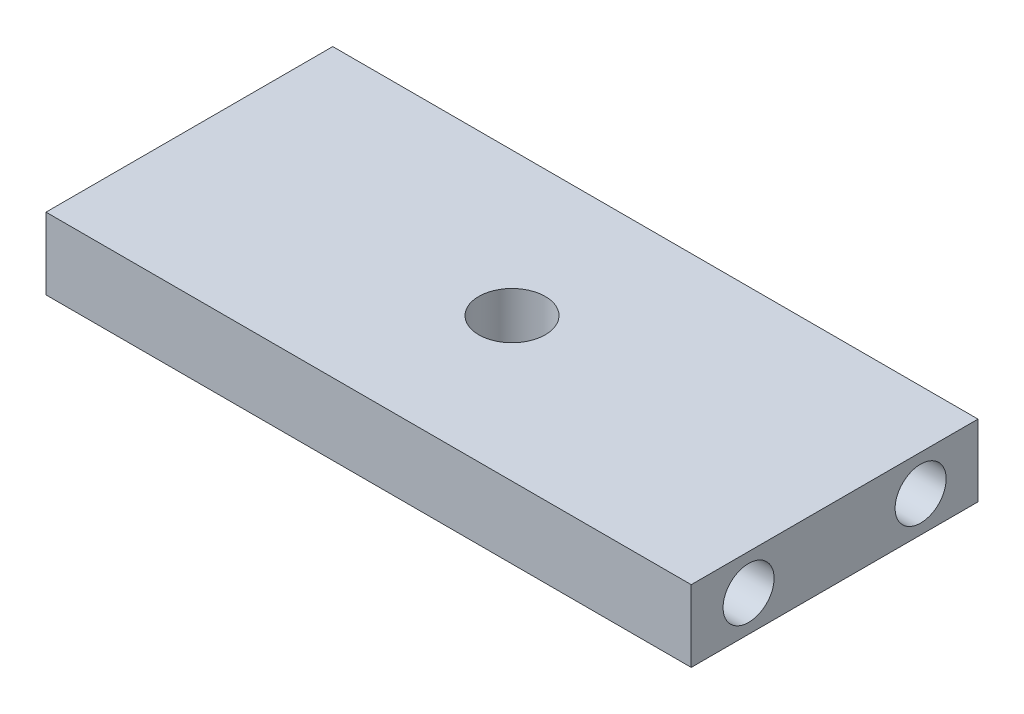
ISO-10303-21;
HEADER;
FILE_DESCRIPTION(('STEP AP214'),'2;1');
FILE_NAME('part.step','',(''),(''),'','','');
FILE_SCHEMA(('AUTOMOTIVE_DESIGN { 1 0 10303 214 1 1 1 1 }'));
ENDSEC;
DATA;
#1=APPLICATION_CONTEXT('core data for automotive mechanical design processes');
#2=APPLICATION_PROTOCOL_DEFINITION('international standard','automotive_design',2000,#1);
#3=PRODUCT_CONTEXT('',#1,'mechanical');
#4=PRODUCT('Part','Part','',(#3));
#5=PRODUCT_RELATED_PRODUCT_CATEGORY('part','',(#4));
#6=PRODUCT_DEFINITION_FORMATION('','',#4);
#7=PRODUCT_DEFINITION_CONTEXT('part definition',#1,'design');
#8=PRODUCT_DEFINITION('design','',#6,#7);
#9=PRODUCT_DEFINITION_SHAPE('','',#8);
#10=(LENGTH_UNIT() NAMED_UNIT(*) SI_UNIT(.MILLI.,.METRE.));
#11=(NAMED_UNIT(*) PLANE_ANGLE_UNIT() SI_UNIT($,.RADIAN.));
#12=(NAMED_UNIT(*) SI_UNIT($,.STERADIAN.) SOLID_ANGLE_UNIT());
#13=UNCERTAINTY_MEASURE_WITH_UNIT(LENGTH_MEASURE(1.E-05),#10,'distance_accuracy_value','');
#14=(GEOMETRIC_REPRESENTATION_CONTEXT(3) GLOBAL_UNCERTAINTY_ASSIGNED_CONTEXT((#13)) GLOBAL_UNIT_ASSIGNED_CONTEXT((#10,
#11,#12)) REPRESENTATION_CONTEXT('',''));
#15=CARTESIAN_POINT('',(0.,0.,0.));
#16=DIRECTION('',(0.,0.,1.));
#17=DIRECTION('',(1.,0.,0.));
#18=AXIS2_PLACEMENT_3D('',#15,#16,#17);
#19=CARTESIAN_POINT('',(28.575,-1.5875,-6.35));
#20=DIRECTION('',(0.,0.,1.));
#21=DIRECTION('',(1.,0.,0.));
#22=AXIS2_PLACEMENT_3D('',#19,#20,#21);
#23=PLANE('',#22);
#24=DIRECTION('',(0.,1.,0.));
#25=VECTOR('',#24,1.);
#26=CARTESIAN_POINT('',(0.,-1.5875,-6.35));
#27=LINE('',#26,#25);
#28=CARTESIAN_POINT('',(0.,-1.5875,-6.35));
#29=VERTEX_POINT('',#28);
#30=CARTESIAN_POINT('',(0.,1.5875,-6.35));
#31=VERTEX_POINT('',#30);
#32=EDGE_CURVE('E136',#29,#31,#27,.T.);
#33=ORIENTED_EDGE('',*,*,#32,.T.);
#34=DIRECTION('',(-1.,0.,0.));
#35=VECTOR('',#34,1.);
#36=CARTESIAN_POINT('',(28.575,1.5875,-6.35));
#37=LINE('',#36,#35);
#38=CARTESIAN_POINT('',(28.575,1.5875,-6.35));
#39=VERTEX_POINT('',#38);
#40=EDGE_CURVE('E11',#39,#31,#37,.T.);
#41=ORIENTED_EDGE('',*,*,#40,.F.);
#42=DIRECTION('',(0.,1.,0.));
#43=VECTOR('',#42,1.);
#44=CARTESIAN_POINT('',(28.575,-1.5875,-6.35));
#45=LINE('',#44,#43);
#46=CARTESIAN_POINT('',(28.575,-1.5875,-6.35));
#47=VERTEX_POINT('',#46);
#48=EDGE_CURVE('E137',#47,#39,#45,.T.);
#49=ORIENTED_EDGE('',*,*,#48,.F.);
#50=DIRECTION('',(-1.,0.,0.));
#51=VECTOR('',#50,1.);
#52=CARTESIAN_POINT('',(28.575,-1.5875,-6.35));
#53=LINE('',#52,#51);
#54=EDGE_CURVE('E143',#47,#29,#53,.T.);
#55=ORIENTED_EDGE('',*,*,#54,.T.);
#56=EDGE_LOOP('',(#33,#41,#49,#55));
#57=FACE_BOUND('',#56,.T.);
#58=ADVANCED_FACE('F37',(#57),#23,.F.);
#59=CARTESIAN_POINT('',(28.575,1.5875,6.35));
#60=DIRECTION('',(0.,-1.,0.));
#61=DIRECTION('',(0.,0.,-1.));
#62=AXIS2_PLACEMENT_3D('',#59,#60,#61);
#63=PLANE('',#62);
#64=CARTESIAN_POINT('',(14.2875,1.5875,0.));
#65=DIRECTION('',(0.,1.,0.));
#66=DIRECTION('',(0.,0.,1.));
#67=AXIS2_PLACEMENT_3D('',#64,#65,#66);
#68=CIRCLE('',#67,1.4732);
#69=CARTESIAN_POINT('',(14.2875,1.5875,1.4732));
#70=VERTEX_POINT('',#69);
#71=EDGE_CURVE('E130',#70,#70,#68,.T.);
#72=ORIENTED_EDGE('',*,*,#71,.F.);
#73=EDGE_LOOP('',(#72));
#74=FACE_BOUND('',#73,.T.);
#75=DIRECTION('',(0.,0.,1.));
#76=VECTOR('',#75,1.);
#77=CARTESIAN_POINT('',(0.,1.5875,6.35));
#78=LINE('',#77,#76);
#79=CARTESIAN_POINT('',(0.,1.5875,6.35));
#80=VERTEX_POINT('',#79);
#81=EDGE_CURVE('E146',#31,#80,#78,.T.);
#82=ORIENTED_EDGE('',*,*,#81,.T.);
#83=DIRECTION('',(-1.,0.,0.));
#84=VECTOR('',#83,1.);
#85=CARTESIAN_POINT('',(28.575,1.5875,6.35));
#86=LINE('',#85,#84);
#87=CARTESIAN_POINT('',(28.575,1.5875,6.35));
#88=VERTEX_POINT('',#87);
#89=EDGE_CURVE('E45',#88,#80,#86,.T.);
#90=ORIENTED_EDGE('',*,*,#89,.F.);
#91=DIRECTION('',(0.,0.,1.));
#92=VECTOR('',#91,1.);
#93=CARTESIAN_POINT('',(28.575,1.5875,6.35));
#94=LINE('',#93,#92);
#95=EDGE_CURVE('E84',#39,#88,#94,.T.);
#96=ORIENTED_EDGE('',*,*,#95,.F.);
#97=ORIENTED_EDGE('',*,*,#40,.T.);
#98=EDGE_LOOP('',(#82,#90,#96,#97));
#99=FACE_BOUND('',#98,.T.);
#100=ADVANCED_FACE('F171',(#74,#99),#63,.F.);
#101=CARTESIAN_POINT('',(28.575,-1.5875,6.35));
#102=DIRECTION('',(0.,0.,-1.));
#103=DIRECTION('',(-1.,0.,0.));
#104=AXIS2_PLACEMENT_3D('',#101,#102,#103);
#105=PLANE('',#104);
#106=DIRECTION('',(0.,-1.,0.));
#107=VECTOR('',#106,1.);
#108=CARTESIAN_POINT('',(0.,-1.5875,6.35));
#109=LINE('',#108,#107);
#110=CARTESIAN_POINT('',(0.,-1.5875,6.35));
#111=VERTEX_POINT('',#110);
#112=EDGE_CURVE('E71',#80,#111,#109,.T.);
#113=ORIENTED_EDGE('',*,*,#112,.T.);
#114=DIRECTION('',(-1.,0.,0.));
#115=VECTOR('',#114,1.);
#116=CARTESIAN_POINT('',(28.575,-1.5875,6.35));
#117=LINE('',#116,#115);
#118=CARTESIAN_POINT('',(28.575,-1.5875,6.35));
#119=VERTEX_POINT('',#118);
#120=EDGE_CURVE('E151',#119,#111,#117,.T.);
#121=ORIENTED_EDGE('',*,*,#120,.F.);
#122=DIRECTION('',(0.,-1.,0.));
#123=VECTOR('',#122,1.);
#124=CARTESIAN_POINT('',(28.575,-1.5875,6.35));
#125=LINE('',#124,#123);
#126=EDGE_CURVE('E140',#88,#119,#125,.T.);
#127=ORIENTED_EDGE('',*,*,#126,.F.);
#128=ORIENTED_EDGE('',*,*,#89,.T.);
#129=EDGE_LOOP('',(#113,#121,#127,#128));
#130=FACE_BOUND('',#129,.T.);
#131=ADVANCED_FACE('F153',(#130),#105,.F.);
#132=CARTESIAN_POINT('',(28.575,-1.5875,6.35));
#133=DIRECTION('',(0.,1.,0.));
#134=DIRECTION('',(0.,0.,1.));
#135=AXIS2_PLACEMENT_3D('',#132,#133,#134);
#136=PLANE('',#135);
#137=CARTESIAN_POINT('',(14.2875,-1.5875,0.));
#138=DIRECTION('',(0.,1.,0.));
#139=DIRECTION('',(0.,0.,1.));
#140=AXIS2_PLACEMENT_3D('',#137,#138,#139);
#141=CIRCLE('',#140,1.4732);
#142=CARTESIAN_POINT('',(14.2875,-1.5875,1.4732));
#143=VERTEX_POINT('',#142);
#144=EDGE_CURVE('E133',#143,#143,#141,.T.);
#145=ORIENTED_EDGE('',*,*,#144,.T.);
#146=EDGE_LOOP('',(#145));
#147=FACE_BOUND('',#146,.T.);
#148=DIRECTION('',(0.,0.,-1.));
#149=VECTOR('',#148,1.);
#150=CARTESIAN_POINT('',(0.,-1.5875,6.35));
#151=LINE('',#150,#149);
#152=EDGE_CURVE('E77',#111,#29,#151,.T.);
#153=ORIENTED_EDGE('',*,*,#152,.T.);
#154=ORIENTED_EDGE('',*,*,#54,.F.);
#155=DIRECTION('',(0.,0.,-1.));
#156=VECTOR('',#155,1.);
#157=CARTESIAN_POINT('',(28.575,-1.5875,6.35));
#158=LINE('',#157,#156);
#159=EDGE_CURVE('E53',#119,#47,#158,.T.);
#160=ORIENTED_EDGE('',*,*,#159,.F.);
#161=ORIENTED_EDGE('',*,*,#120,.T.);
#162=EDGE_LOOP('',(#153,#154,#160,#161));
#163=FACE_BOUND('',#162,.T.);
#164=ADVANCED_FACE('F160',(#147,#163),#136,.F.);
#165=CARTESIAN_POINT('',(28.575,0.,0.));
#166=DIRECTION('',(-1.,0.,0.));
#167=DIRECTION('',(0.,0.,1.));
#168=AXIS2_PLACEMENT_3D('',#165,#166,#167);
#169=PLANE('',#168);
#170=CARTESIAN_POINT('',(28.575,0.,3.81));
#171=DIRECTION('',(1.,0.,0.));
#172=DIRECTION('',(0.,0.,-1.));
#173=AXIS2_PLACEMENT_3D('',#170,#171,#172);
#174=CIRCLE('',#173,1.13029999999999);
#175=CARTESIAN_POINT('',(28.575,0.,2.67970000000001));
#176=VERTEX_POINT('',#175);
#177=EDGE_CURVE('E108',#176,#176,#174,.T.);
#178=ORIENTED_EDGE('',*,*,#177,.F.);
#179=EDGE_LOOP('',(#178));
#180=FACE_BOUND('',#179,.T.);
#181=CARTESIAN_POINT('',(28.575,0.,-3.81));
#182=DIRECTION('',(1.,0.,0.));
#183=DIRECTION('',(0.,0.,-1.));
#184=AXIS2_PLACEMENT_3D('',#181,#182,#183);
#185=CIRCLE('',#184,1.13029999999999);
#186=CARTESIAN_POINT('',(28.575,0.,-4.94029999999999));
#187=VERTEX_POINT('',#186);
#188=EDGE_CURVE('E107',#187,#187,#185,.T.);
#189=ORIENTED_EDGE('',*,*,#188,.F.);
#190=EDGE_LOOP('',(#189));
#191=FACE_BOUND('',#190,.T.);
#192=ORIENTED_EDGE('',*,*,#48,.T.);
#193=ORIENTED_EDGE('',*,*,#95,.T.);
#194=ORIENTED_EDGE('',*,*,#126,.T.);
#195=ORIENTED_EDGE('',*,*,#159,.T.);
#196=EDGE_LOOP('',(#192,#193,#194,#195));
#197=FACE_BOUND('',#196,.T.);
#198=ADVANCED_FACE('F162',(#180,#191,#197),#169,.F.);
#199=CARTESIAN_POINT('',(0.,0.,0.));
#200=DIRECTION('',(-1.,0.,0.));
#201=DIRECTION('',(0.,0.,1.));
#202=AXIS2_PLACEMENT_3D('',#199,#200,#201);
#203=PLANE('',#202);
#204=CARTESIAN_POINT('',(0.,0.,-3.81));
#205=DIRECTION('',(-1.,0.,0.));
#206=DIRECTION('',(0.,0.,1.));
#207=AXIS2_PLACEMENT_3D('',#204,#205,#206);
#208=CIRCLE('',#207,1.13029999999999);
#209=CARTESIAN_POINT('',(0.,0.,-2.67970000000001));
#210=VERTEX_POINT('',#209);
#211=EDGE_CURVE('E118',#210,#210,#208,.T.);
#212=ORIENTED_EDGE('',*,*,#211,.F.);
#213=EDGE_LOOP('',(#212));
#214=FACE_BOUND('',#213,.T.);
#215=CARTESIAN_POINT('',(0.,0.,3.81));
#216=DIRECTION('',(-1.,0.,0.));
#217=DIRECTION('',(0.,0.,1.));
#218=AXIS2_PLACEMENT_3D('',#215,#216,#217);
#219=CIRCLE('',#218,1.13029999999999);
#220=CARTESIAN_POINT('',(0.,0.,4.94029999999999));
#221=VERTEX_POINT('',#220);
#222=EDGE_CURVE('E124',#221,#221,#219,.T.);
#223=ORIENTED_EDGE('',*,*,#222,.F.);
#224=EDGE_LOOP('',(#223));
#225=FACE_BOUND('',#224,.T.);
#226=ORIENTED_EDGE('',*,*,#32,.F.);
#227=ORIENTED_EDGE('',*,*,#152,.F.);
#228=ORIENTED_EDGE('',*,*,#112,.F.);
#229=ORIENTED_EDGE('',*,*,#81,.F.);
#230=EDGE_LOOP('',(#226,#227,#228,#229));
#231=FACE_BOUND('',#230,.T.);
#232=ADVANCED_FACE('F156',(#214,#225,#231),#203,.T.);
#233=CARTESIAN_POINT('',(14.2875,1.5875,0.));
#234=DIRECTION('',(0.,1.,0.));
#235=DIRECTION('',(0.,0.,1.));
#236=AXIS2_PLACEMENT_3D('',#233,#234,#235);
#237=CYLINDRICAL_SURFACE('',#236,1.4732);
#238=ORIENTED_EDGE('',*,*,#71,.T.);
#239=EDGE_LOOP('',(#238));
#240=FACE_BOUND('',#239,.T.);
#241=ORIENTED_EDGE('',*,*,#144,.F.);
#242=EDGE_LOOP('',(#241));
#243=FACE_BOUND('',#242,.T.);
#244=ADVANCED_FACE('F183',(#240,#243),#237,.F.);
#245=CARTESIAN_POINT('',(7.62,0.,3.81));
#246=DIRECTION('',(-1.,0.,0.));
#247=DIRECTION('',(0.,0.,1.));
#248=AXIS2_PLACEMENT_3D('',#245,#246,#247);
#249=CONICAL_SURFACE('',#248,1.13029999999999,1.02974425867665);
#250=CARTESIAN_POINT('',(8.29915275768685,0.,3.81));
#251=VERTEX_POINT('',#250);
#252=VERTEX_LOOP('',#251);
#253=FACE_BOUND('',#252,.T.);
#254=CARTESIAN_POINT('',(7.62,0.,3.81));
#255=DIRECTION('',(-1.,0.,0.));
#256=DIRECTION('',(0.,0.,1.));
#257=AXIS2_PLACEMENT_3D('',#254,#255,#256);
#258=CIRCLE('',#257,1.13029999999999);
#259=CARTESIAN_POINT('',(7.62,0.,4.94029999999999));
#260=VERTEX_POINT('',#259);
#261=EDGE_CURVE('E127',#260,#260,#258,.T.);
#262=ORIENTED_EDGE('',*,*,#261,.T.);
#263=EDGE_LOOP('',(#262));
#264=FACE_BOUND('',#263,.T.);
#265=ADVANCED_FACE('F186',(#253,#264),#249,.F.);
#266=CARTESIAN_POINT('',(0.,0.,3.81));
#267=DIRECTION('',(-1.,0.,0.));
#268=DIRECTION('',(0.,0.,1.));
#269=AXIS2_PLACEMENT_3D('',#266,#267,#268);
#270=CYLINDRICAL_SURFACE('',#269,1.13029999999999);
#271=ORIENTED_EDGE('',*,*,#261,.F.);
#272=EDGE_LOOP('',(#271));
#273=FACE_BOUND('',#272,.T.);
#274=ORIENTED_EDGE('',*,*,#222,.T.);
#275=EDGE_LOOP('',(#274));
#276=FACE_BOUND('',#275,.T.);
#277=ADVANCED_FACE('F193',(#273,#276),#270,.F.);
#278=CARTESIAN_POINT('',(7.62,0.,-3.81));
#279=DIRECTION('',(-1.,0.,0.));
#280=DIRECTION('',(0.,0.,1.));
#281=AXIS2_PLACEMENT_3D('',#278,#279,#280);
#282=CONICAL_SURFACE('',#281,1.13029999999999,1.02974425867665);
#283=CARTESIAN_POINT('',(8.29915275768685,0.,-3.81));
#284=VERTEX_POINT('',#283);
#285=VERTEX_LOOP('',#284);
#286=FACE_BOUND('',#285,.T.);
#287=CARTESIAN_POINT('',(7.62,0.,-3.81));
#288=DIRECTION('',(-1.,0.,0.));
#289=DIRECTION('',(0.,0.,1.));
#290=AXIS2_PLACEMENT_3D('',#287,#288,#289);
#291=CIRCLE('',#290,1.13029999999999);
#292=CARTESIAN_POINT('',(7.62,0.,-2.67970000000001));
#293=VERTEX_POINT('',#292);
#294=EDGE_CURVE('E121',#293,#293,#291,.T.);
#295=ORIENTED_EDGE('',*,*,#294,.T.);
#296=EDGE_LOOP('',(#295));
#297=FACE_BOUND('',#296,.T.);
#298=ADVANCED_FACE('F200',(#286,#297),#282,.F.);
#299=CARTESIAN_POINT('',(0.,0.,-3.81));
#300=DIRECTION('',(-1.,0.,0.));
#301=DIRECTION('',(0.,0.,1.));
#302=AXIS2_PLACEMENT_3D('',#299,#300,#301);
#303=CYLINDRICAL_SURFACE('',#302,1.13029999999999);
#304=ORIENTED_EDGE('',*,*,#294,.F.);
#305=EDGE_LOOP('',(#304));
#306=FACE_BOUND('',#305,.T.);
#307=ORIENTED_EDGE('',*,*,#211,.T.);
#308=EDGE_LOOP('',(#307));
#309=FACE_BOUND('',#308,.T.);
#310=ADVANCED_FACE('F204',(#306,#309),#303,.F.);
#311=CARTESIAN_POINT('',(20.955,0.,-3.81));
#312=DIRECTION('',(1.,0.,0.));
#313=DIRECTION('',(0.,0.,-1.));
#314=AXIS2_PLACEMENT_3D('',#311,#312,#313);
#315=CONICAL_SURFACE('',#314,1.13029999999999,1.02974425867665);
#316=CARTESIAN_POINT('',(20.2758472423132,0.,-3.81));
#317=VERTEX_POINT('',#316);
#318=VERTEX_LOOP('',#317);
#319=FACE_BOUND('',#318,.T.);
#320=CARTESIAN_POINT('',(20.955,0.,-3.81));
#321=DIRECTION('',(1.,0.,0.));
#322=DIRECTION('',(0.,0.,-1.));
#323=AXIS2_PLACEMENT_3D('',#320,#321,#322);
#324=CIRCLE('',#323,1.13029999999999);
#325=CARTESIAN_POINT('',(20.955,0.,-4.94029999999999));
#326=VERTEX_POINT('',#325);
#327=EDGE_CURVE('E111',#326,#326,#324,.T.);
#328=ORIENTED_EDGE('',*,*,#327,.T.);
#329=EDGE_LOOP('',(#328));
#330=FACE_BOUND('',#329,.T.);
#331=ADVANCED_FACE('F208',(#319,#330),#315,.F.);
#332=CARTESIAN_POINT('',(28.575,0.,-3.81));
#333=DIRECTION('',(1.,0.,0.));
#334=DIRECTION('',(0.,0.,-1.));
#335=AXIS2_PLACEMENT_3D('',#332,#333,#334);
#336=CYLINDRICAL_SURFACE('',#335,1.13029999999999);
#337=ORIENTED_EDGE('',*,*,#327,.F.);
#338=EDGE_LOOP('',(#337));
#339=FACE_BOUND('',#338,.T.);
#340=ORIENTED_EDGE('',*,*,#188,.T.);
#341=EDGE_LOOP('',(#340));
#342=FACE_BOUND('',#341,.T.);
#343=ADVANCED_FACE('F101',(#339,#342),#336,.F.);
#344=CARTESIAN_POINT('',(20.955,0.,3.81));
#345=DIRECTION('',(1.,0.,0.));
#346=DIRECTION('',(0.,0.,-1.));
#347=AXIS2_PLACEMENT_3D('',#344,#345,#346);
#348=CONICAL_SURFACE('',#347,1.13029999999999,1.02974425867665);
#349=CARTESIAN_POINT('',(20.2758472423132,0.,3.81));
#350=VERTEX_POINT('',#349);
#351=VERTEX_LOOP('',#350);
#352=FACE_BOUND('',#351,.T.);
#353=CARTESIAN_POINT('',(20.955,0.,3.81));
#354=DIRECTION('',(1.,0.,0.));
#355=DIRECTION('',(0.,0.,-1.));
#356=AXIS2_PLACEMENT_3D('',#353,#354,#355);
#357=CIRCLE('',#356,1.13029999999999);
#358=CARTESIAN_POINT('',(20.955,0.,2.67970000000001));
#359=VERTEX_POINT('',#358);
#360=EDGE_CURVE('E105',#359,#359,#357,.T.);
#361=ORIENTED_EDGE('',*,*,#360,.T.);
#362=EDGE_LOOP('',(#361));
#363=FACE_BOUND('',#362,.T.);
#364=ADVANCED_FACE('F97',(#352,#363),#348,.F.);
#365=CARTESIAN_POINT('',(28.575,0.,3.81));
#366=DIRECTION('',(1.,0.,0.));
#367=DIRECTION('',(0.,0.,-1.));
#368=AXIS2_PLACEMENT_3D('',#365,#366,#367);
#369=CYLINDRICAL_SURFACE('',#368,1.13029999999999);
#370=ORIENTED_EDGE('',*,*,#360,.F.);
#371=EDGE_LOOP('',(#370));
#372=FACE_BOUND('',#371,.T.);
#373=ORIENTED_EDGE('',*,*,#177,.T.);
#374=EDGE_LOOP('',(#373));
#375=FACE_BOUND('',#374,.T.);
#376=ADVANCED_FACE('F100',(#372,#375),#369,.F.);
#377=CLOSED_SHELL('',(#58,#100,#131,#164,#198,#232,#244,#265,#277,#298,#310,#331,#343,#364,#376));
#378=MANIFOLD_SOLID_BREP('B2',#377);
#379=ADVANCED_BREP_SHAPE_REPRESENTATION('',(#18,#378),#14);
#380=SHAPE_DEFINITION_REPRESENTATION(#9,#379);
ENDSEC;
END-ISO-10303-21;
